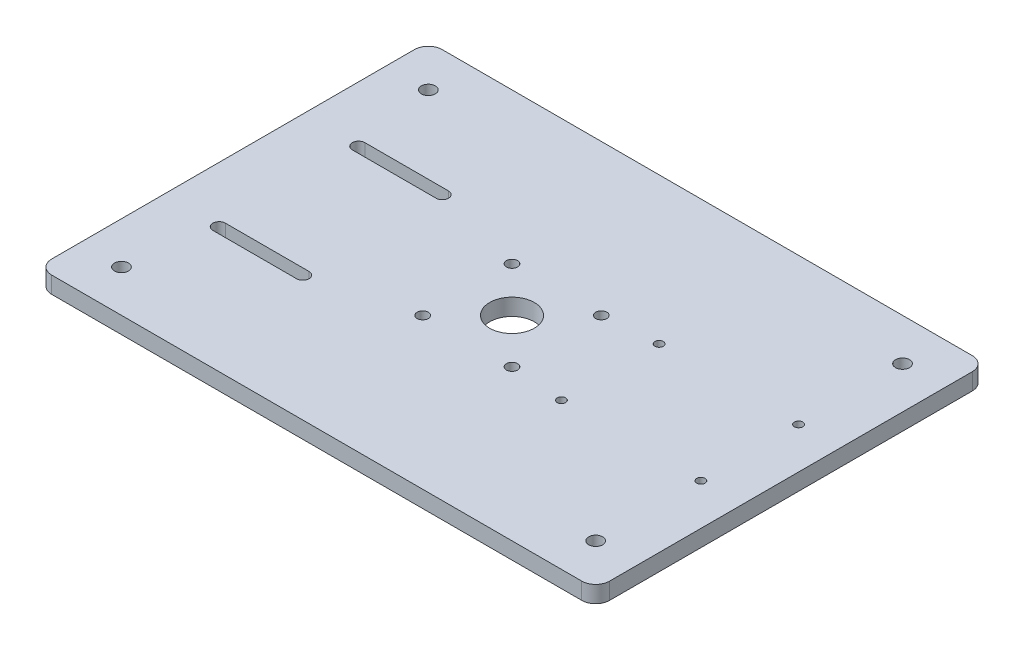
ISO-10303-21;
HEADER;
FILE_DESCRIPTION(('STEP AP214'),'2;1');
FILE_NAME('part.step','',(''),(''),'','','');
FILE_SCHEMA(('AUTOMOTIVE_DESIGN { 1 0 10303 214 1 1 1 1 }'));
ENDSEC;
DATA;
#1=APPLICATION_CONTEXT('core data for automotive mechanical design processes');
#2=APPLICATION_PROTOCOL_DEFINITION('international standard','automotive_design',2000,#1);
#3=PRODUCT_CONTEXT('',#1,'mechanical');
#4=PRODUCT('Part','Part','',(#3));
#5=PRODUCT_RELATED_PRODUCT_CATEGORY('part','',(#4));
#6=PRODUCT_DEFINITION_FORMATION('','',#4);
#7=PRODUCT_DEFINITION_CONTEXT('part definition',#1,'design');
#8=PRODUCT_DEFINITION('design','',#6,#7);
#9=PRODUCT_DEFINITION_SHAPE('','',#8);
#10=(LENGTH_UNIT() NAMED_UNIT(*) SI_UNIT(.MILLI.,.METRE.));
#11=(NAMED_UNIT(*) PLANE_ANGLE_UNIT() SI_UNIT($,.RADIAN.));
#12=(NAMED_UNIT(*) SI_UNIT($,.STERADIAN.) SOLID_ANGLE_UNIT());
#13=UNCERTAINTY_MEASURE_WITH_UNIT(LENGTH_MEASURE(1.E-05),#10,'distance_accuracy_value','');
#14=(GEOMETRIC_REPRESENTATION_CONTEXT(3) GLOBAL_UNCERTAINTY_ASSIGNED_CONTEXT((#13)) GLOBAL_UNIT_ASSIGNED_CONTEXT((#10,
#11,#12)) REPRESENTATION_CONTEXT('',''));
#15=CARTESIAN_POINT('',(0.,0.,0.));
#16=DIRECTION('',(0.,0.,1.));
#17=DIRECTION('',(1.,0.,0.));
#18=AXIS2_PLACEMENT_3D('',#15,#16,#17);
#19=CARTESIAN_POINT('',(100.,6.,-70.));
#20=DIRECTION('',(-1.,0.,0.));
#21=DIRECTION('',(0.,0.,1.));
#22=AXIS2_PLACEMENT_3D('',#19,#20,#21);
#23=PLANE('',#22);
#24=DIRECTION('',(0.,0.,-1.));
#25=VECTOR('',#24,1.);
#26=CARTESIAN_POINT('',(100.,0.,-70.));
#27=LINE('',#26,#25);
#28=CARTESIAN_POINT('',(100.,0.,65.));
#29=VERTEX_POINT('',#28);
#30=CARTESIAN_POINT('',(100.,0.,-65.));
#31=VERTEX_POINT('',#30);
#32=EDGE_CURVE('E276',#29,#31,#27,.T.);
#33=ORIENTED_EDGE('',*,*,#32,.T.);
#34=DIRECTION('',(0.,-1.,0.));
#35=VECTOR('',#34,1.);
#36=CARTESIAN_POINT('',(100.,6.,-65.));
#37=LINE('',#36,#35);
#38=CARTESIAN_POINT('',(100.,6.,-65.));
#39=VERTEX_POINT('',#38);
#40=EDGE_CURVE('E11',#31,#39,#37,.F.);
#41=ORIENTED_EDGE('',*,*,#40,.T.);
#42=DIRECTION('',(0.,0.,-1.));
#43=VECTOR('',#42,1.);
#44=CARTESIAN_POINT('',(100.,6.,-70.));
#45=LINE('',#44,#43);
#46=CARTESIAN_POINT('',(100.,6.,65.));
#47=VERTEX_POINT('',#46);
#48=EDGE_CURVE('E279',#47,#39,#45,.T.);
#49=ORIENTED_EDGE('',*,*,#48,.F.);
#50=DIRECTION('',(0.,-1.,0.));
#51=VECTOR('',#50,1.);
#52=CARTESIAN_POINT('',(100.,6.,65.));
#53=LINE('',#52,#51);
#54=EDGE_CURVE('E47',#47,#29,#53,.T.);
#55=ORIENTED_EDGE('',*,*,#54,.T.);
#56=EDGE_LOOP('',(#33,#41,#49,#55));
#57=FACE_BOUND('',#56,.T.);
#58=ADVANCED_FACE('F39',(#57),#23,.F.);
#59=CARTESIAN_POINT('',(-100.,6.,-70.));
#60=DIRECTION('',(0.,0.,1.));
#61=DIRECTION('',(1.,0.,0.));
#62=AXIS2_PLACEMENT_3D('',#59,#60,#61);
#63=PLANE('',#62);
#64=DIRECTION('',(-1.,0.,0.));
#65=VECTOR('',#64,1.);
#66=CARTESIAN_POINT('',(-100.,0.,-70.));
#67=LINE('',#66,#65);
#68=CARTESIAN_POINT('',(95.,0.,-70.));
#69=VERTEX_POINT('',#68);
#70=CARTESIAN_POINT('',(-95.,0.,-70.));
#71=VERTEX_POINT('',#70);
#72=EDGE_CURVE('E295',#69,#71,#67,.T.);
#73=ORIENTED_EDGE('',*,*,#72,.T.);
#74=DIRECTION('',(0.,-1.,0.));
#75=VECTOR('',#74,1.);
#76=CARTESIAN_POINT('',(-95.,6.,-70.));
#77=LINE('',#76,#75);
#78=CARTESIAN_POINT('',(-95.,6.,-70.));
#79=VERTEX_POINT('',#78);
#80=EDGE_CURVE('E318',#71,#79,#77,.F.);
#81=ORIENTED_EDGE('',*,*,#80,.T.);
#82=DIRECTION('',(-1.,0.,0.));
#83=VECTOR('',#82,1.);
#84=CARTESIAN_POINT('',(-100.,6.,-70.));
#85=LINE('',#84,#83);
#86=CARTESIAN_POINT('',(95.,6.,-70.));
#87=VERTEX_POINT('',#86);
#88=EDGE_CURVE('E282',#87,#79,#85,.T.);
#89=ORIENTED_EDGE('',*,*,#88,.F.);
#90=DIRECTION('',(0.,-1.,0.));
#91=VECTOR('',#90,1.);
#92=CARTESIAN_POINT('',(95.,6.,-70.));
#93=LINE('',#92,#91);
#94=EDGE_CURVE('E315',#87,#69,#93,.T.);
#95=ORIENTED_EDGE('',*,*,#94,.T.);
#96=EDGE_LOOP('',(#73,#81,#89,#95));
#97=FACE_BOUND('',#96,.T.);
#98=ADVANCED_FACE('F350',(#97),#63,.F.);
#99=CARTESIAN_POINT('',(-100.,6.,-70.));
#100=DIRECTION('',(1.,0.,0.));
#101=DIRECTION('',(0.,0.,-1.));
#102=AXIS2_PLACEMENT_3D('',#99,#100,#101);
#103=PLANE('',#102);
#104=DIRECTION('',(0.,0.,1.));
#105=VECTOR('',#104,1.);
#106=CARTESIAN_POINT('',(-100.,6.,-70.));
#107=LINE('',#106,#105);
#108=CARTESIAN_POINT('',(-100.,6.,-65.));
#109=VERTEX_POINT('',#108);
#110=CARTESIAN_POINT('',(-100.,6.,65.));
#111=VERTEX_POINT('',#110);
#112=EDGE_CURVE('E286',#109,#111,#107,.T.);
#113=ORIENTED_EDGE('',*,*,#112,.F.);
#114=DIRECTION('',(0.,-1.,0.));
#115=VECTOR('',#114,1.);
#116=CARTESIAN_POINT('',(-100.,6.,-65.));
#117=LINE('',#116,#115);
#118=CARTESIAN_POINT('',(-100.,0.,-65.));
#119=VERTEX_POINT('',#118);
#120=EDGE_CURVE('E304',#109,#119,#117,.T.);
#121=ORIENTED_EDGE('',*,*,#120,.T.);
#122=DIRECTION('',(0.,0.,1.));
#123=VECTOR('',#122,1.);
#124=CARTESIAN_POINT('',(-100.,0.,-70.));
#125=LINE('',#124,#123);
#126=CARTESIAN_POINT('',(-100.,0.,65.));
#127=VERTEX_POINT('',#126);
#128=EDGE_CURVE('E298',#119,#127,#125,.T.);
#129=ORIENTED_EDGE('',*,*,#128,.T.);
#130=DIRECTION('',(0.,-1.,0.));
#131=VECTOR('',#130,1.);
#132=CARTESIAN_POINT('',(-100.,6.,65.));
#133=LINE('',#132,#131);
#134=EDGE_CURVE('E292',#127,#111,#133,.F.);
#135=ORIENTED_EDGE('',*,*,#134,.T.);
#136=EDGE_LOOP('',(#113,#121,#129,#135));
#137=FACE_BOUND('',#136,.T.);
#138=ADVANCED_FACE('F360',(#137),#103,.F.);
#139=CARTESIAN_POINT('',(-100.,6.,70.));
#140=DIRECTION('',(0.,0.,-1.));
#141=DIRECTION('',(-1.,0.,0.));
#142=AXIS2_PLACEMENT_3D('',#139,#140,#141);
#143=PLANE('',#142);
#144=DIRECTION('',(1.,0.,0.));
#145=VECTOR('',#144,1.);
#146=CARTESIAN_POINT('',(-100.,6.,70.));
#147=LINE('',#146,#145);
#148=CARTESIAN_POINT('',(-95.,6.,70.));
#149=VERTEX_POINT('',#148);
#150=CARTESIAN_POINT('',(95.,6.,70.));
#151=VERTEX_POINT('',#150);
#152=EDGE_CURVE('E289',#149,#151,#147,.T.);
#153=ORIENTED_EDGE('',*,*,#152,.F.);
#154=DIRECTION('',(0.,-1.,0.));
#155=VECTOR('',#154,1.);
#156=CARTESIAN_POINT('',(-95.,6.,70.));
#157=LINE('',#156,#155);
#158=CARTESIAN_POINT('',(-95.,0.,70.));
#159=VERTEX_POINT('',#158);
#160=EDGE_CURVE('E330',#149,#159,#157,.T.);
#161=ORIENTED_EDGE('',*,*,#160,.T.);
#162=DIRECTION('',(1.,0.,0.));
#163=VECTOR('',#162,1.);
#164=CARTESIAN_POINT('',(-100.,0.,70.));
#165=LINE('',#164,#163);
#166=CARTESIAN_POINT('',(95.,0.,70.));
#167=VERTEX_POINT('',#166);
#168=EDGE_CURVE('E283',#159,#167,#165,.T.);
#169=ORIENTED_EDGE('',*,*,#168,.T.);
#170=DIRECTION('',(0.,-1.,0.));
#171=VECTOR('',#170,1.);
#172=CARTESIAN_POINT('',(95.,6.,70.));
#173=LINE('',#172,#171);
#174=EDGE_CURVE('E328',#167,#151,#173,.F.);
#175=ORIENTED_EDGE('',*,*,#174,.T.);
#176=EDGE_LOOP('',(#153,#161,#169,#175));
#177=FACE_BOUND('',#176,.T.);
#178=ADVANCED_FACE('F368',(#177),#143,.F.);
#179=CARTESIAN_POINT('',(0.,6.,0.));
#180=DIRECTION('',(0.,1.,0.));
#181=DIRECTION('',(0.,0.,1.));
#182=AXIS2_PLACEMENT_3D('',#179,#180,#181);
#183=PLANE('',#182);
#184=CARTESIAN_POINT('',(85.2222673702819,6.,17.4999999999999));
#185=DIRECTION('',(0.,1.,0.));
#186=DIRECTION('',(0.,0.,1.));
#187=AXIS2_PLACEMENT_3D('',#184,#185,#186);
#188=CIRCLE('',#187,1.5);
#189=CARTESIAN_POINT('',(85.2222673702819,6.,18.9999999999999));
#190=VERTEX_POINT('',#189);
#191=EDGE_CURVE('E674',#190,#190,#188,.T.);
#192=ORIENTED_EDGE('',*,*,#191,.F.);
#193=EDGE_LOOP('',(#192));
#194=FACE_BOUND('',#193,.T.);
#195=CARTESIAN_POINT('',(85.2222673702818,6.,-17.5000000000001));
#196=DIRECTION('',(0.,1.,0.));
#197=DIRECTION('',(0.,0.,1.));
#198=AXIS2_PLACEMENT_3D('',#195,#196,#197);
#199=CIRCLE('',#198,1.5);
#200=CARTESIAN_POINT('',(85.2222673702818,6.,-16.0000000000001));
#201=VERTEX_POINT('',#200);
#202=EDGE_CURVE('E678',#201,#201,#199,.T.);
#203=ORIENTED_EDGE('',*,*,#202,.F.);
#204=EDGE_LOOP('',(#203));
#205=FACE_BOUND('',#204,.T.);
#206=CARTESIAN_POINT('',(35.2222673702818,6.,-17.4999999999999));
#207=DIRECTION('',(0.,1.,0.));
#208=DIRECTION('',(0.,0.,1.));
#209=AXIS2_PLACEMENT_3D('',#206,#207,#208);
#210=CIRCLE('',#209,1.5);
#211=CARTESIAN_POINT('',(35.2222673702818,6.,-15.9999999999999));
#212=VERTEX_POINT('',#211);
#213=EDGE_CURVE('E671',#212,#212,#210,.T.);
#214=ORIENTED_EDGE('',*,*,#213,.F.);
#215=EDGE_LOOP('',(#214));
#216=FACE_BOUND('',#215,.T.);
#217=CARTESIAN_POINT('',(35.2222673702819,6.,17.5000000000001));
#218=DIRECTION('',(0.,1.,0.));
#219=DIRECTION('',(0.,0.,1.));
#220=AXIS2_PLACEMENT_3D('',#217,#218,#219);
#221=CIRCLE('',#220,1.50000000000001);
#222=CARTESIAN_POINT('',(35.2222673702819,6.,19.0000000000001));
#223=VERTEX_POINT('',#222);
#224=EDGE_CURVE('E178',#223,#223,#221,.T.);
#225=ORIENTED_EDGE('',*,*,#224,.F.);
#226=EDGE_LOOP('',(#225));
#227=FACE_BOUND('',#226,.T.);
#228=CARTESIAN_POINT('',(-80.,6.,-25.));
#229=DIRECTION('',(0.,1.,0.));
#230=DIRECTION('',(0.,0.,1.));
#231=AXIS2_PLACEMENT_3D('',#228,#229,#230);
#232=CIRCLE('',#231,2.25);
#233=CARTESIAN_POINT('',(-80.,6.,-27.25));
#234=VERTEX_POINT('',#233);
#235=CARTESIAN_POINT('',(-80.,6.,-22.75));
#236=VERTEX_POINT('',#235);
#237=EDGE_CURVE('E54',#234,#236,#232,.T.);
#238=ORIENTED_EDGE('',*,*,#237,.F.);
#239=DIRECTION('',(-1.,0.,0.));
#240=VECTOR('',#239,1.);
#241=CARTESIAN_POINT('',(-80.,6.,-27.25));
#242=LINE('',#241,#240);
#243=CARTESIAN_POINT('',(-50.,6.,-27.25));
#244=VERTEX_POINT('',#243);
#245=EDGE_CURVE('E172',#244,#234,#242,.T.);
#246=ORIENTED_EDGE('',*,*,#245,.F.);
#247=CARTESIAN_POINT('',(-50.,6.,-25.));
#248=DIRECTION('',(0.,1.,0.));
#249=DIRECTION('',(0.,0.,1.));
#250=AXIS2_PLACEMENT_3D('',#247,#248,#249);
#251=CIRCLE('',#250,2.24999999999999);
#252=CARTESIAN_POINT('',(-50.,6.,-22.75));
#253=VERTEX_POINT('',#252);
#254=EDGE_CURVE('E175',#253,#244,#251,.T.);
#255=ORIENTED_EDGE('',*,*,#254,.F.);
#256=DIRECTION('',(1.,0.,0.));
#257=VECTOR('',#256,1.);
#258=CARTESIAN_POINT('',(-80.,6.,-22.75));
#259=LINE('',#258,#257);
#260=EDGE_CURVE('E184',#236,#253,#259,.T.);
#261=ORIENTED_EDGE('',*,*,#260,.F.);
#262=EDGE_LOOP('',(#238,#246,#255,#261));
#263=FACE_BOUND('',#262,.T.);
#264=CARTESIAN_POINT('',(-80.,6.,25.));
#265=DIRECTION('',(0.,1.,0.));
#266=DIRECTION('',(0.,0.,1.));
#267=AXIS2_PLACEMENT_3D('',#264,#265,#266);
#268=CIRCLE('',#267,2.25);
#269=CARTESIAN_POINT('',(-80.,6.,22.75));
#270=VERTEX_POINT('',#269);
#271=CARTESIAN_POINT('',(-80.,6.,27.25));
#272=VERTEX_POINT('',#271);
#273=EDGE_CURVE('E62',#270,#272,#268,.T.);
#274=ORIENTED_EDGE('',*,*,#273,.F.);
#275=DIRECTION('',(-1.,0.,0.));
#276=VECTOR('',#275,1.);
#277=CARTESIAN_POINT('',(-80.,6.,22.75));
#278=LINE('',#277,#276);
#279=CARTESIAN_POINT('',(-50.,6.,22.75));
#280=VERTEX_POINT('',#279);
#281=EDGE_CURVE('E204',#280,#270,#278,.T.);
#282=ORIENTED_EDGE('',*,*,#281,.F.);
#283=CARTESIAN_POINT('',(-50.,6.,25.));
#284=DIRECTION('',(0.,1.,0.));
#285=DIRECTION('',(0.,0.,1.));
#286=AXIS2_PLACEMENT_3D('',#283,#284,#285);
#287=CIRCLE('',#286,2.25);
#288=CARTESIAN_POINT('',(-50.,6.,27.25));
#289=VERTEX_POINT('',#288);
#290=EDGE_CURVE('E207',#289,#280,#287,.T.);
#291=ORIENTED_EDGE('',*,*,#290,.F.);
#292=DIRECTION('',(1.,0.,0.));
#293=VECTOR('',#292,1.);
#294=CARTESIAN_POINT('',(-80.,6.,27.25));
#295=LINE('',#294,#293);
#296=EDGE_CURVE('E211',#272,#289,#295,.T.);
#297=ORIENTED_EDGE('',*,*,#296,.F.);
#298=EDGE_LOOP('',(#274,#282,#291,#297));
#299=FACE_BOUND('',#298,.T.);
#300=CARTESIAN_POINT('',(-16.,6.,-16.));
#301=DIRECTION('',(0.,1.,0.));
#302=DIRECTION('',(0.,0.,1.));
#303=AXIS2_PLACEMENT_3D('',#300,#301,#302);
#304=CIRCLE('',#303,2.);
#305=CARTESIAN_POINT('',(-16.,6.,-14.));
#306=VERTEX_POINT('',#305);
#307=EDGE_CURVE('E238',#306,#306,#304,.T.);
#308=ORIENTED_EDGE('',*,*,#307,.F.);
#309=EDGE_LOOP('',(#308));
#310=FACE_BOUND('',#309,.T.);
#311=CARTESIAN_POINT('',(-16.,6.,16.));
#312=DIRECTION('',(0.,1.,0.));
#313=DIRECTION('',(0.,0.,1.));
#314=AXIS2_PLACEMENT_3D('',#311,#312,#313);
#315=CIRCLE('',#314,2.);
#316=CARTESIAN_POINT('',(-16.,6.,18.));
#317=VERTEX_POINT('',#316);
#318=EDGE_CURVE('E232',#317,#317,#315,.T.);
#319=ORIENTED_EDGE('',*,*,#318,.F.);
#320=EDGE_LOOP('',(#319));
#321=FACE_BOUND('',#320,.T.);
#322=CARTESIAN_POINT('',(16.,6.,16.));
#323=DIRECTION('',(0.,1.,0.));
#324=DIRECTION('',(0.,0.,1.));
#325=AXIS2_PLACEMENT_3D('',#322,#323,#324);
#326=CIRCLE('',#325,2.);
#327=CARTESIAN_POINT('',(16.,6.,18.));
#328=VERTEX_POINT('',#327);
#329=EDGE_CURVE('E225',#328,#328,#326,.T.);
#330=ORIENTED_EDGE('',*,*,#329,.F.);
#331=EDGE_LOOP('',(#330));
#332=FACE_BOUND('',#331,.T.);
#333=CARTESIAN_POINT('',(16.,6.,-16.));
#334=DIRECTION('',(0.,1.,0.));
#335=DIRECTION('',(0.,0.,1.));
#336=AXIS2_PLACEMENT_3D('',#333,#334,#335);
#337=CIRCLE('',#336,2.);
#338=CARTESIAN_POINT('',(16.,6.,-14.));
#339=VERTEX_POINT('',#338);
#340=EDGE_CURVE('E228',#339,#339,#337,.T.);
#341=ORIENTED_EDGE('',*,*,#340,.F.);
#342=EDGE_LOOP('',(#341));
#343=FACE_BOUND('',#342,.T.);
#344=CARTESIAN_POINT('',(0.,6.,0.));
#345=DIRECTION('',(0.,1.,0.));
#346=DIRECTION('',(0.,0.,1.));
#347=AXIS2_PLACEMENT_3D('',#344,#345,#346);
#348=CIRCLE('',#347,8.);
#349=CARTESIAN_POINT('',(0.,6.,8.));
#350=VERTEX_POINT('',#349);
#351=EDGE_CURVE('E246',#350,#350,#348,.T.);
#352=ORIENTED_EDGE('',*,*,#351,.F.);
#353=EDGE_LOOP('',(#352));
#354=FACE_BOUND('',#353,.T.);
#355=CARTESIAN_POINT('',(85.,6.,-55.));
#356=DIRECTION('',(0.,1.,0.));
#357=DIRECTION('',(0.,0.,-1.));
#358=AXIS2_PLACEMENT_3D('',#355,#356,#357);
#359=CIRCLE('',#358,2.5);
#360=CARTESIAN_POINT('',(85.,6.,-57.5));
#361=VERTEX_POINT('',#360);
#362=EDGE_CURVE('E268',#361,#361,#359,.T.);
#363=ORIENTED_EDGE('',*,*,#362,.F.);
#364=EDGE_LOOP('',(#363));
#365=FACE_BOUND('',#364,.T.);
#366=CARTESIAN_POINT('',(85.,6.,55.));
#367=DIRECTION('',(0.,1.,0.));
#368=DIRECTION('',(0.,0.,1.));
#369=AXIS2_PLACEMENT_3D('',#366,#367,#368);
#370=CIRCLE('',#369,2.5);
#371=CARTESIAN_POINT('',(85.,6.,57.5));
#372=VERTEX_POINT('',#371);
#373=EDGE_CURVE('E262',#372,#372,#370,.T.);
#374=ORIENTED_EDGE('',*,*,#373,.F.);
#375=EDGE_LOOP('',(#374));
#376=FACE_BOUND('',#375,.T.);
#377=CARTESIAN_POINT('',(-85.,6.,55.));
#378=DIRECTION('',(0.,1.,0.));
#379=DIRECTION('',(0.,0.,-1.));
#380=AXIS2_PLACEMENT_3D('',#377,#378,#379);
#381=CIRCLE('',#380,2.5);
#382=CARTESIAN_POINT('',(-85.,6.,52.5));
#383=VERTEX_POINT('',#382);
#384=EDGE_CURVE('E255',#383,#383,#381,.T.);
#385=ORIENTED_EDGE('',*,*,#384,.F.);
#386=EDGE_LOOP('',(#385));
#387=FACE_BOUND('',#386,.T.);
#388=CARTESIAN_POINT('',(-85.,6.,-55.));
#389=DIRECTION('',(0.,1.,0.));
#390=DIRECTION('',(0.,0.,1.));
#391=AXIS2_PLACEMENT_3D('',#388,#389,#390);
#392=CIRCLE('',#391,2.5);
#393=CARTESIAN_POINT('',(-85.,6.,-52.5));
#394=VERTEX_POINT('',#393);
#395=EDGE_CURVE('E258',#394,#394,#392,.T.);
#396=ORIENTED_EDGE('',*,*,#395,.F.);
#397=EDGE_LOOP('',(#396));
#398=FACE_BOUND('',#397,.T.);
#399=ORIENTED_EDGE('',*,*,#88,.T.);
#400=CARTESIAN_POINT('',(-95.,6.,-65.));
#401=DIRECTION('',(0.,1.,0.));
#402=DIRECTION('',(0.,0.,1.));
#403=AXIS2_PLACEMENT_3D('',#400,#401,#402);
#404=CIRCLE('',#403,5.);
#405=EDGE_CURVE('E326',#79,#109,#404,.T.);
#406=ORIENTED_EDGE('',*,*,#405,.T.);
#407=ORIENTED_EDGE('',*,*,#112,.T.);
#408=CARTESIAN_POINT('',(-95.,6.,65.));
#409=DIRECTION('',(0.,1.,0.));
#410=DIRECTION('',(0.,0.,1.));
#411=AXIS2_PLACEMENT_3D('',#408,#409,#410);
#412=CIRCLE('',#411,5.);
#413=EDGE_CURVE('E324',#111,#149,#412,.T.);
#414=ORIENTED_EDGE('',*,*,#413,.T.);
#415=ORIENTED_EDGE('',*,*,#152,.T.);
#416=CARTESIAN_POINT('',(95.,6.,65.));
#417=DIRECTION('',(0.,1.,0.));
#418=DIRECTION('',(0.,0.,1.));
#419=AXIS2_PLACEMENT_3D('',#416,#417,#418);
#420=CIRCLE('',#419,5.);
#421=EDGE_CURVE('E320',#151,#47,#420,.T.);
#422=ORIENTED_EDGE('',*,*,#421,.T.);
#423=ORIENTED_EDGE('',*,*,#48,.T.);
#424=CARTESIAN_POINT('',(95.,6.,-65.));
#425=DIRECTION('',(0.,1.,0.));
#426=DIRECTION('',(0.,0.,1.));
#427=AXIS2_PLACEMENT_3D('',#424,#425,#426);
#428=CIRCLE('',#427,5.);
#429=EDGE_CURVE('E322',#39,#87,#428,.T.);
#430=ORIENTED_EDGE('',*,*,#429,.T.);
#431=EDGE_LOOP('',(#399,#406,#407,#414,#415,#422,#423,#430));
#432=FACE_BOUND('',#431,.T.);
#433=ADVANCED_FACE('F354',(#194,#205,#216,#227,#263,#299,#310,#321,#332,#343,#354,#365,#376,
#387,#398,#432),#183,.T.);
#434=CARTESIAN_POINT('',(0.,0.,0.));
#435=DIRECTION('',(0.,1.,0.));
#436=DIRECTION('',(0.,0.,1.));
#437=AXIS2_PLACEMENT_3D('',#434,#435,#436);
#438=PLANE('',#437);
#439=CARTESIAN_POINT('',(85.2222673702819,0.,17.4999999999999));
#440=DIRECTION('',(0.,1.,0.));
#441=DIRECTION('',(0.,0.,1.));
#442=AXIS2_PLACEMENT_3D('',#439,#440,#441);
#443=CIRCLE('',#442,1.5);
#444=CARTESIAN_POINT('',(85.2222673702819,0.,18.9999999999999));
#445=VERTEX_POINT('',#444);
#446=EDGE_CURVE('E659',#445,#445,#443,.T.);
#447=ORIENTED_EDGE('',*,*,#446,.T.);
#448=EDGE_LOOP('',(#447));
#449=FACE_BOUND('',#448,.T.);
#450=CARTESIAN_POINT('',(85.2222673702818,0.,-17.5000000000001));
#451=DIRECTION('',(0.,1.,0.));
#452=DIRECTION('',(0.,0.,1.));
#453=AXIS2_PLACEMENT_3D('',#450,#451,#452);
#454=CIRCLE('',#453,1.5);
#455=CARTESIAN_POINT('',(85.2222673702818,0.,-16.0000000000001));
#456=VERTEX_POINT('',#455);
#457=EDGE_CURVE('E663',#456,#456,#454,.T.);
#458=ORIENTED_EDGE('',*,*,#457,.T.);
#459=EDGE_LOOP('',(#458));
#460=FACE_BOUND('',#459,.T.);
#461=CARTESIAN_POINT('',(35.2222673702818,0.,-17.4999999999999));
#462=DIRECTION('',(0.,1.,0.));
#463=DIRECTION('',(0.,0.,1.));
#464=AXIS2_PLACEMENT_3D('',#461,#462,#463);
#465=CIRCLE('',#464,1.5);
#466=CARTESIAN_POINT('',(35.2222673702818,0.,-15.9999999999999));
#467=VERTEX_POINT('',#466);
#468=EDGE_CURVE('E667',#467,#467,#465,.T.);
#469=ORIENTED_EDGE('',*,*,#468,.T.);
#470=EDGE_LOOP('',(#469));
#471=FACE_BOUND('',#470,.T.);
#472=CARTESIAN_POINT('',(35.2222673702819,0.,17.5000000000001));
#473=DIRECTION('',(0.,1.,0.));
#474=DIRECTION('',(0.,0.,1.));
#475=AXIS2_PLACEMENT_3D('',#472,#473,#474);
#476=CIRCLE('',#475,1.50000000000001);
#477=CARTESIAN_POINT('',(35.2222673702819,0.,19.0000000000001));
#478=VERTEX_POINT('',#477);
#479=EDGE_CURVE('E203',#478,#478,#476,.T.);
#480=ORIENTED_EDGE('',*,*,#479,.T.);
#481=EDGE_LOOP('',(#480));
#482=FACE_BOUND('',#481,.T.);
#483=DIRECTION('',(-1.,0.,0.));
#484=VECTOR('',#483,1.);
#485=CARTESIAN_POINT('',(-80.,0.,-27.25));
#486=LINE('',#485,#484);
#487=CARTESIAN_POINT('',(-50.,0.,-27.25));
#488=VERTEX_POINT('',#487);
#489=CARTESIAN_POINT('',(-80.,0.,-27.25));
#490=VERTEX_POINT('',#489);
#491=EDGE_CURVE('E159',#488,#490,#486,.T.);
#492=ORIENTED_EDGE('',*,*,#491,.T.);
#493=CARTESIAN_POINT('',(-80.,0.,-25.));
#494=DIRECTION('',(0.,1.,0.));
#495=DIRECTION('',(0.,0.,1.));
#496=AXIS2_PLACEMENT_3D('',#493,#494,#495);
#497=CIRCLE('',#496,2.25);
#498=CARTESIAN_POINT('',(-80.,0.,-22.75));
#499=VERTEX_POINT('',#498);
#500=EDGE_CURVE('E153',#490,#499,#497,.T.);
#501=ORIENTED_EDGE('',*,*,#500,.T.);
#502=DIRECTION('',(1.,0.,0.));
#503=VECTOR('',#502,1.);
#504=CARTESIAN_POINT('',(-80.,0.,-22.75));
#505=LINE('',#504,#503);
#506=CARTESIAN_POINT('',(-50.,0.,-22.75));
#507=VERTEX_POINT('',#506);
#508=EDGE_CURVE('E163',#499,#507,#505,.T.);
#509=ORIENTED_EDGE('',*,*,#508,.T.);
#510=CARTESIAN_POINT('',(-50.,0.,-25.));
#511=DIRECTION('',(0.,1.,0.));
#512=DIRECTION('',(0.,0.,1.));
#513=AXIS2_PLACEMENT_3D('',#510,#511,#512);
#514=CIRCLE('',#513,2.24999999999999);
#515=EDGE_CURVE('E167',#507,#488,#514,.T.);
#516=ORIENTED_EDGE('',*,*,#515,.T.);
#517=EDGE_LOOP('',(#492,#501,#509,#516));
#518=FACE_BOUND('',#517,.T.);
#519=DIRECTION('',(-1.,0.,0.));
#520=VECTOR('',#519,1.);
#521=CARTESIAN_POINT('',(-80.,0.,22.75));
#522=LINE('',#521,#520);
#523=CARTESIAN_POINT('',(-50.,0.,22.75));
#524=VERTEX_POINT('',#523);
#525=CARTESIAN_POINT('',(-80.,0.,22.75));
#526=VERTEX_POINT('',#525);
#527=EDGE_CURVE('E196',#524,#526,#522,.T.);
#528=ORIENTED_EDGE('',*,*,#527,.T.);
#529=CARTESIAN_POINT('',(-80.,0.,25.));
#530=DIRECTION('',(0.,1.,0.));
#531=DIRECTION('',(0.,0.,1.));
#532=AXIS2_PLACEMENT_3D('',#529,#530,#531);
#533=CIRCLE('',#532,2.25);
#534=CARTESIAN_POINT('',(-80.,0.,27.25));
#535=VERTEX_POINT('',#534);
#536=EDGE_CURVE('E208',#526,#535,#533,.T.);
#537=ORIENTED_EDGE('',*,*,#536,.T.);
#538=DIRECTION('',(1.,0.,0.));
#539=VECTOR('',#538,1.);
#540=CARTESIAN_POINT('',(-80.,0.,27.25));
#541=LINE('',#540,#539);
#542=CARTESIAN_POINT('',(-50.,0.,27.25));
#543=VERTEX_POINT('',#542);
#544=EDGE_CURVE('E220',#535,#543,#541,.T.);
#545=ORIENTED_EDGE('',*,*,#544,.T.);
#546=CARTESIAN_POINT('',(-50.,0.,25.));
#547=DIRECTION('',(0.,1.,0.));
#548=DIRECTION('',(0.,0.,1.));
#549=AXIS2_PLACEMENT_3D('',#546,#547,#548);
#550=CIRCLE('',#549,2.25);
#551=EDGE_CURVE('E217',#543,#524,#550,.T.);
#552=ORIENTED_EDGE('',*,*,#551,.T.);
#553=EDGE_LOOP('',(#528,#537,#545,#552));
#554=FACE_BOUND('',#553,.T.);
#555=CARTESIAN_POINT('',(-16.,0.,-16.));
#556=DIRECTION('',(0.,1.,0.));
#557=DIRECTION('',(0.,0.,1.));
#558=AXIS2_PLACEMENT_3D('',#555,#556,#557);
#559=CIRCLE('',#558,2.);
#560=CARTESIAN_POINT('',(-16.,0.,-14.));
#561=VERTEX_POINT('',#560);
#562=EDGE_CURVE('E190',#561,#561,#559,.T.);
#563=ORIENTED_EDGE('',*,*,#562,.T.);
#564=EDGE_LOOP('',(#563));
#565=FACE_BOUND('',#564,.T.);
#566=CARTESIAN_POINT('',(-16.,0.,16.));
#567=DIRECTION('',(0.,1.,0.));
#568=DIRECTION('',(0.,0.,1.));
#569=AXIS2_PLACEMENT_3D('',#566,#567,#568);
#570=CIRCLE('',#569,2.);
#571=CARTESIAN_POINT('',(-16.,0.,18.));
#572=VERTEX_POINT('',#571);
#573=EDGE_CURVE('E235',#572,#572,#570,.T.);
#574=ORIENTED_EDGE('',*,*,#573,.T.);
#575=EDGE_LOOP('',(#574));
#576=FACE_BOUND('',#575,.T.);
#577=CARTESIAN_POINT('',(16.,0.,16.));
#578=DIRECTION('',(0.,1.,0.));
#579=DIRECTION('',(0.,0.,1.));
#580=AXIS2_PLACEMENT_3D('',#577,#578,#579);
#581=CIRCLE('',#580,2.);
#582=CARTESIAN_POINT('',(16.,0.,18.));
#583=VERTEX_POINT('',#582);
#584=EDGE_CURVE('E229',#583,#583,#581,.T.);
#585=ORIENTED_EDGE('',*,*,#584,.T.);
#586=EDGE_LOOP('',(#585));
#587=FACE_BOUND('',#586,.T.);
#588=CARTESIAN_POINT('',(16.,0.,-16.));
#589=DIRECTION('',(0.,1.,0.));
#590=DIRECTION('',(0.,0.,1.));
#591=AXIS2_PLACEMENT_3D('',#588,#589,#590);
#592=CIRCLE('',#591,2.);
#593=CARTESIAN_POINT('',(16.,0.,-14.));
#594=VERTEX_POINT('',#593);
#595=EDGE_CURVE('E243',#594,#594,#592,.T.);
#596=ORIENTED_EDGE('',*,*,#595,.T.);
#597=EDGE_LOOP('',(#596));
#598=FACE_BOUND('',#597,.T.);
#599=CARTESIAN_POINT('',(0.,0.,0.));
#600=DIRECTION('',(0.,1.,0.));
#601=DIRECTION('',(0.,0.,1.));
#602=AXIS2_PLACEMENT_3D('',#599,#600,#601);
#603=CIRCLE('',#602,8.);
#604=CARTESIAN_POINT('',(0.,0.,8.));
#605=VERTEX_POINT('',#604);
#606=EDGE_CURVE('E249',#605,#605,#603,.T.);
#607=ORIENTED_EDGE('',*,*,#606,.T.);
#608=EDGE_LOOP('',(#607));
#609=FACE_BOUND('',#608,.T.);
#610=CARTESIAN_POINT('',(85.,0.,-55.));
#611=DIRECTION('',(0.,1.,0.));
#612=DIRECTION('',(0.,0.,-1.));
#613=AXIS2_PLACEMENT_3D('',#610,#611,#612);
#614=CIRCLE('',#613,2.5);
#615=CARTESIAN_POINT('',(85.,0.,-57.5));
#616=VERTEX_POINT('',#615);
#617=EDGE_CURVE('E252',#616,#616,#614,.T.);
#618=ORIENTED_EDGE('',*,*,#617,.T.);
#619=EDGE_LOOP('',(#618));
#620=FACE_BOUND('',#619,.T.);
#621=CARTESIAN_POINT('',(85.,0.,55.));
#622=DIRECTION('',(0.,1.,0.));
#623=DIRECTION('',(0.,0.,1.));
#624=AXIS2_PLACEMENT_3D('',#621,#622,#623);
#625=CIRCLE('',#624,2.5);
#626=CARTESIAN_POINT('',(85.,0.,57.5));
#627=VERTEX_POINT('',#626);
#628=EDGE_CURVE('E265',#627,#627,#625,.T.);
#629=ORIENTED_EDGE('',*,*,#628,.T.);
#630=EDGE_LOOP('',(#629));
#631=FACE_BOUND('',#630,.T.);
#632=CARTESIAN_POINT('',(-85.,0.,55.));
#633=DIRECTION('',(0.,1.,0.));
#634=DIRECTION('',(0.,0.,-1.));
#635=AXIS2_PLACEMENT_3D('',#632,#633,#634);
#636=CIRCLE('',#635,2.5);
#637=CARTESIAN_POINT('',(-85.,0.,52.5));
#638=VERTEX_POINT('',#637);
#639=EDGE_CURVE('E259',#638,#638,#636,.T.);
#640=ORIENTED_EDGE('',*,*,#639,.T.);
#641=EDGE_LOOP('',(#640));
#642=FACE_BOUND('',#641,.T.);
#643=CARTESIAN_POINT('',(-85.,0.,-55.));
#644=DIRECTION('',(0.,1.,0.));
#645=DIRECTION('',(0.,0.,1.));
#646=AXIS2_PLACEMENT_3D('',#643,#644,#645);
#647=CIRCLE('',#646,2.5);
#648=CARTESIAN_POINT('',(-85.,0.,-52.5));
#649=VERTEX_POINT('',#648);
#650=EDGE_CURVE('E273',#649,#649,#647,.T.);
#651=ORIENTED_EDGE('',*,*,#650,.T.);
#652=EDGE_LOOP('',(#651));
#653=FACE_BOUND('',#652,.T.);
#654=ORIENTED_EDGE('',*,*,#128,.F.);
#655=CARTESIAN_POINT('',(-95.,0.,-65.));
#656=DIRECTION('',(0.,1.,0.));
#657=DIRECTION('',(0.,0.,1.));
#658=AXIS2_PLACEMENT_3D('',#655,#656,#657);
#659=CIRCLE('',#658,5.);
#660=EDGE_CURVE('E313',#119,#71,#659,.F.);
#661=ORIENTED_EDGE('',*,*,#660,.T.);
#662=ORIENTED_EDGE('',*,*,#72,.F.);
#663=CARTESIAN_POINT('',(95.,0.,-65.));
#664=DIRECTION('',(0.,1.,0.));
#665=DIRECTION('',(0.,0.,1.));
#666=AXIS2_PLACEMENT_3D('',#663,#664,#665);
#667=CIRCLE('',#666,5.);
#668=EDGE_CURVE('E309',#69,#31,#667,.F.);
#669=ORIENTED_EDGE('',*,*,#668,.T.);
#670=ORIENTED_EDGE('',*,*,#32,.F.);
#671=CARTESIAN_POINT('',(95.,0.,65.));
#672=DIRECTION('',(0.,1.,0.));
#673=DIRECTION('',(0.,0.,1.));
#674=AXIS2_PLACEMENT_3D('',#671,#672,#673);
#675=CIRCLE('',#674,5.);
#676=EDGE_CURVE('E307',#29,#167,#675,.F.);
#677=ORIENTED_EDGE('',*,*,#676,.T.);
#678=ORIENTED_EDGE('',*,*,#168,.F.);
#679=CARTESIAN_POINT('',(-95.,0.,65.));
#680=DIRECTION('',(0.,1.,0.));
#681=DIRECTION('',(0.,0.,1.));
#682=AXIS2_PLACEMENT_3D('',#679,#680,#681);
#683=CIRCLE('',#682,5.);
#684=EDGE_CURVE('E311',#159,#127,#683,.F.);
#685=ORIENTED_EDGE('',*,*,#684,.T.);
#686=EDGE_LOOP('',(#654,#661,#662,#669,#670,#677,#678,#685));
#687=FACE_BOUND('',#686,.T.);
#688=ADVANCED_FACE('F169',(#449,#460,#471,#482,#518,#554,#565,#576,#587,#598,#609,#620,#631,
#642,#653,#687),#438,.F.);
#689=CARTESIAN_POINT('',(-95.,6.,-65.));
#690=DIRECTION('',(0.,-1.,0.));
#691=DIRECTION('',(0.,0.,-1.));
#692=AXIS2_PLACEMENT_3D('',#689,#690,#691);
#693=CYLINDRICAL_SURFACE('',#692,5.);
#694=ORIENTED_EDGE('',*,*,#405,.F.);
#695=ORIENTED_EDGE('',*,*,#80,.F.);
#696=ORIENTED_EDGE('',*,*,#660,.F.);
#697=ORIENTED_EDGE('',*,*,#120,.F.);
#698=EDGE_LOOP('',(#694,#695,#696,#697));
#699=FACE_BOUND('',#698,.T.);
#700=ADVANCED_FACE('F358',(#699),#693,.T.);
#701=CARTESIAN_POINT('',(-95.,6.,65.));
#702=DIRECTION('',(0.,-1.,0.));
#703=DIRECTION('',(0.,0.,-1.));
#704=AXIS2_PLACEMENT_3D('',#701,#702,#703);
#705=CYLINDRICAL_SURFACE('',#704,5.);
#706=ORIENTED_EDGE('',*,*,#413,.F.);
#707=ORIENTED_EDGE('',*,*,#134,.F.);
#708=ORIENTED_EDGE('',*,*,#684,.F.);
#709=ORIENTED_EDGE('',*,*,#160,.F.);
#710=EDGE_LOOP('',(#706,#707,#708,#709));
#711=FACE_BOUND('',#710,.T.);
#712=ADVANCED_FACE('F365',(#711),#705,.T.);
#713=CARTESIAN_POINT('',(95.,6.,-65.));
#714=DIRECTION('',(0.,-1.,0.));
#715=DIRECTION('',(0.,0.,-1.));
#716=AXIS2_PLACEMENT_3D('',#713,#714,#715);
#717=CYLINDRICAL_SURFACE('',#716,5.);
#718=ORIENTED_EDGE('',*,*,#429,.F.);
#719=ORIENTED_EDGE('',*,*,#40,.F.);
#720=ORIENTED_EDGE('',*,*,#668,.F.);
#721=ORIENTED_EDGE('',*,*,#94,.F.);
#722=EDGE_LOOP('',(#718,#719,#720,#721));
#723=FACE_BOUND('',#722,.T.);
#724=ADVANCED_FACE('F347',(#723),#717,.T.);
#725=CARTESIAN_POINT('',(95.,6.,65.));
#726=DIRECTION('',(0.,-1.,0.));
#727=DIRECTION('',(0.,0.,-1.));
#728=AXIS2_PLACEMENT_3D('',#725,#726,#727);
#729=CYLINDRICAL_SURFACE('',#728,5.);
#730=ORIENTED_EDGE('',*,*,#421,.F.);
#731=ORIENTED_EDGE('',*,*,#174,.F.);
#732=ORIENTED_EDGE('',*,*,#676,.F.);
#733=ORIENTED_EDGE('',*,*,#54,.F.);
#734=EDGE_LOOP('',(#730,#731,#732,#733));
#735=FACE_BOUND('',#734,.T.);
#736=ADVANCED_FACE('F41',(#735),#729,.T.);
#737=CARTESIAN_POINT('',(-85.,0.,-55.));
#738=DIRECTION('',(0.,1.,0.));
#739=DIRECTION('',(0.,0.,1.));
#740=AXIS2_PLACEMENT_3D('',#737,#738,#739);
#741=CYLINDRICAL_SURFACE('',#740,2.5);
#742=ORIENTED_EDGE('',*,*,#650,.F.);
#743=EDGE_LOOP('',(#742));
#744=FACE_BOUND('',#743,.T.);
#745=ORIENTED_EDGE('',*,*,#395,.T.);
#746=EDGE_LOOP('',(#745));
#747=FACE_BOUND('',#746,.T.);
#748=ADVANCED_FACE('F371',(#744,#747),#741,.F.);
#749=CARTESIAN_POINT('',(-85.,0.,55.));
#750=DIRECTION('',(0.,1.,0.));
#751=DIRECTION('',(0.,0.,1.));
#752=AXIS2_PLACEMENT_3D('',#749,#750,#751);
#753=CYLINDRICAL_SURFACE('',#752,2.5);
#754=ORIENTED_EDGE('',*,*,#639,.F.);
#755=EDGE_LOOP('',(#754));
#756=FACE_BOUND('',#755,.T.);
#757=ORIENTED_EDGE('',*,*,#384,.T.);
#758=EDGE_LOOP('',(#757));
#759=FACE_BOUND('',#758,.T.);
#760=ADVANCED_FACE('F376',(#756,#759),#753,.F.);
#761=CARTESIAN_POINT('',(85.,0.,55.));
#762=DIRECTION('',(0.,1.,0.));
#763=DIRECTION('',(0.,0.,1.));
#764=AXIS2_PLACEMENT_3D('',#761,#762,#763);
#765=CYLINDRICAL_SURFACE('',#764,2.5);
#766=ORIENTED_EDGE('',*,*,#628,.F.);
#767=EDGE_LOOP('',(#766));
#768=FACE_BOUND('',#767,.T.);
#769=ORIENTED_EDGE('',*,*,#373,.T.);
#770=EDGE_LOOP('',(#769));
#771=FACE_BOUND('',#770,.T.);
#772=ADVANCED_FACE('F420',(#768,#771),#765,.F.);
#773=CARTESIAN_POINT('',(85.,0.,-55.));
#774=DIRECTION('',(0.,1.,0.));
#775=DIRECTION('',(0.,0.,1.));
#776=AXIS2_PLACEMENT_3D('',#773,#774,#775);
#777=CYLINDRICAL_SURFACE('',#776,2.5);
#778=ORIENTED_EDGE('',*,*,#617,.F.);
#779=EDGE_LOOP('',(#778));
#780=FACE_BOUND('',#779,.T.);
#781=ORIENTED_EDGE('',*,*,#362,.T.);
#782=EDGE_LOOP('',(#781));
#783=FACE_BOUND('',#782,.T.);
#784=ADVANCED_FACE('F430',(#780,#783),#777,.F.);
#785=CARTESIAN_POINT('',(0.,0.,0.));
#786=DIRECTION('',(0.,1.,0.));
#787=DIRECTION('',(0.,0.,1.));
#788=AXIS2_PLACEMENT_3D('',#785,#786,#787);
#789=CYLINDRICAL_SURFACE('',#788,8.);
#790=ORIENTED_EDGE('',*,*,#606,.F.);
#791=EDGE_LOOP('',(#790));
#792=FACE_BOUND('',#791,.T.);
#793=ORIENTED_EDGE('',*,*,#351,.T.);
#794=EDGE_LOOP('',(#793));
#795=FACE_BOUND('',#794,.T.);
#796=ADVANCED_FACE('F440',(#792,#795),#789,.F.);
#797=CARTESIAN_POINT('',(16.,0.,-16.));
#798=DIRECTION('',(0.,1.,0.));
#799=DIRECTION('',(0.,0.,1.));
#800=AXIS2_PLACEMENT_3D('',#797,#798,#799);
#801=CYLINDRICAL_SURFACE('',#800,2.);
#802=ORIENTED_EDGE('',*,*,#595,.F.);
#803=EDGE_LOOP('',(#802));
#804=FACE_BOUND('',#803,.T.);
#805=ORIENTED_EDGE('',*,*,#340,.T.);
#806=EDGE_LOOP('',(#805));
#807=FACE_BOUND('',#806,.T.);
#808=ADVANCED_FACE('F450',(#804,#807),#801,.F.);
#809=CARTESIAN_POINT('',(16.,0.,16.));
#810=DIRECTION('',(0.,1.,0.));
#811=DIRECTION('',(0.,0.,1.));
#812=AXIS2_PLACEMENT_3D('',#809,#810,#811);
#813=CYLINDRICAL_SURFACE('',#812,2.);
#814=ORIENTED_EDGE('',*,*,#584,.F.);
#815=EDGE_LOOP('',(#814));
#816=FACE_BOUND('',#815,.T.);
#817=ORIENTED_EDGE('',*,*,#329,.T.);
#818=EDGE_LOOP('',(#817));
#819=FACE_BOUND('',#818,.T.);
#820=ADVANCED_FACE('F460',(#816,#819),#813,.F.);
#821=CARTESIAN_POINT('',(-16.,0.,16.));
#822=DIRECTION('',(0.,1.,0.));
#823=DIRECTION('',(0.,0.,1.));
#824=AXIS2_PLACEMENT_3D('',#821,#822,#823);
#825=CYLINDRICAL_SURFACE('',#824,2.);
#826=ORIENTED_EDGE('',*,*,#573,.F.);
#827=EDGE_LOOP('',(#826));
#828=FACE_BOUND('',#827,.T.);
#829=ORIENTED_EDGE('',*,*,#318,.T.);
#830=EDGE_LOOP('',(#829));
#831=FACE_BOUND('',#830,.T.);
#832=ADVANCED_FACE('F470',(#828,#831),#825,.F.);
#833=CARTESIAN_POINT('',(-16.,0.,-16.));
#834=DIRECTION('',(0.,1.,0.));
#835=DIRECTION('',(0.,0.,1.));
#836=AXIS2_PLACEMENT_3D('',#833,#834,#835);
#837=CYLINDRICAL_SURFACE('',#836,2.);
#838=ORIENTED_EDGE('',*,*,#562,.F.);
#839=EDGE_LOOP('',(#838));
#840=FACE_BOUND('',#839,.T.);
#841=ORIENTED_EDGE('',*,*,#307,.T.);
#842=EDGE_LOOP('',(#841));
#843=FACE_BOUND('',#842,.T.);
#844=ADVANCED_FACE('F480',(#840,#843),#837,.F.);
#845=CARTESIAN_POINT('',(-80.,0.,25.));
#846=DIRECTION('',(0.,1.,0.));
#847=DIRECTION('',(0.,0.,1.));
#848=AXIS2_PLACEMENT_3D('',#845,#846,#847);
#849=CYLINDRICAL_SURFACE('',#848,2.25);
#850=ORIENTED_EDGE('',*,*,#273,.T.);
#851=DIRECTION('',(0.,1.,0.));
#852=VECTOR('',#851,1.);
#853=CARTESIAN_POINT('',(-80.,0.,27.25));
#854=LINE('',#853,#852);
#855=EDGE_CURVE('E194',#535,#272,#854,.T.);
#856=ORIENTED_EDGE('',*,*,#855,.F.);
#857=ORIENTED_EDGE('',*,*,#536,.F.);
#858=DIRECTION('',(0.,1.,0.));
#859=VECTOR('',#858,1.);
#860=CARTESIAN_POINT('',(-80.,0.,22.75));
#861=LINE('',#860,#859);
#862=EDGE_CURVE('E201',#526,#270,#861,.T.);
#863=ORIENTED_EDGE('',*,*,#862,.T.);
#864=EDGE_LOOP('',(#850,#856,#857,#863));
#865=FACE_BOUND('',#864,.T.);
#866=ADVANCED_FACE('F490',(#865),#849,.F.);
#867=CARTESIAN_POINT('',(-80.,0.,22.75));
#868=DIRECTION('',(0.,0.,-1.));
#869=DIRECTION('',(-1.,0.,0.));
#870=AXIS2_PLACEMENT_3D('',#867,#868,#869);
#871=PLANE('',#870);
#872=ORIENTED_EDGE('',*,*,#281,.T.);
#873=ORIENTED_EDGE('',*,*,#862,.F.);
#874=ORIENTED_EDGE('',*,*,#527,.F.);
#875=DIRECTION('',(0.,1.,0.));
#876=VECTOR('',#875,1.);
#877=CARTESIAN_POINT('',(-50.,0.,22.75));
#878=LINE('',#877,#876);
#879=EDGE_CURVE('E199',#524,#280,#878,.T.);
#880=ORIENTED_EDGE('',*,*,#879,.T.);
#881=EDGE_LOOP('',(#872,#873,#874,#880));
#882=FACE_BOUND('',#881,.T.);
#883=ADVANCED_FACE('F500',(#882),#871,.F.);
#884=CARTESIAN_POINT('',(-50.,0.,25.));
#885=DIRECTION('',(0.,1.,0.));
#886=DIRECTION('',(0.,0.,1.));
#887=AXIS2_PLACEMENT_3D('',#884,#885,#886);
#888=CYLINDRICAL_SURFACE('',#887,2.25);
#889=ORIENTED_EDGE('',*,*,#290,.T.);
#890=ORIENTED_EDGE('',*,*,#879,.F.);
#891=ORIENTED_EDGE('',*,*,#551,.F.);
#892=DIRECTION('',(0.,1.,0.));
#893=VECTOR('',#892,1.);
#894=CARTESIAN_POINT('',(-50.,0.,27.25));
#895=LINE('',#894,#893);
#896=EDGE_CURVE('E197',#543,#289,#895,.T.);
#897=ORIENTED_EDGE('',*,*,#896,.T.);
#898=EDGE_LOOP('',(#889,#890,#891,#897));
#899=FACE_BOUND('',#898,.T.);
#900=ADVANCED_FACE('F509',(#899),#888,.F.);
#901=CARTESIAN_POINT('',(-80.,0.,27.25));
#902=DIRECTION('',(0.,0.,1.));
#903=DIRECTION('',(1.,0.,0.));
#904=AXIS2_PLACEMENT_3D('',#901,#902,#903);
#905=PLANE('',#904);
#906=ORIENTED_EDGE('',*,*,#296,.T.);
#907=ORIENTED_EDGE('',*,*,#896,.F.);
#908=ORIENTED_EDGE('',*,*,#544,.F.);
#909=ORIENTED_EDGE('',*,*,#855,.T.);
#910=EDGE_LOOP('',(#906,#907,#908,#909));
#911=FACE_BOUND('',#910,.T.);
#912=ADVANCED_FACE('F519',(#911),#905,.F.);
#913=CARTESIAN_POINT('',(-80.,0.,-25.));
#914=DIRECTION('',(0.,1.,0.));
#915=DIRECTION('',(0.,0.,1.));
#916=AXIS2_PLACEMENT_3D('',#913,#914,#915);
#917=CYLINDRICAL_SURFACE('',#916,2.25);
#918=ORIENTED_EDGE('',*,*,#237,.T.);
#919=DIRECTION('',(0.,1.,0.));
#920=VECTOR('',#919,1.);
#921=CARTESIAN_POINT('',(-80.,0.,-22.75));
#922=LINE('',#921,#920);
#923=EDGE_CURVE('E149',#499,#236,#922,.T.);
#924=ORIENTED_EDGE('',*,*,#923,.F.);
#925=ORIENTED_EDGE('',*,*,#500,.F.);
#926=DIRECTION('',(0.,1.,0.));
#927=VECTOR('',#926,1.);
#928=CARTESIAN_POINT('',(-80.,0.,-27.25));
#929=LINE('',#928,#927);
#930=EDGE_CURVE('E188',#490,#234,#929,.T.);
#931=ORIENTED_EDGE('',*,*,#930,.T.);
#932=EDGE_LOOP('',(#918,#924,#925,#931));
#933=FACE_BOUND('',#932,.T.);
#934=ADVANCED_FACE('F151',(#933),#917,.F.);
#935=CARTESIAN_POINT('',(-80.,0.,-27.25));
#936=DIRECTION('',(0.,0.,-1.));
#937=DIRECTION('',(-1.,0.,0.));
#938=AXIS2_PLACEMENT_3D('',#935,#936,#937);
#939=PLANE('',#938);
#940=ORIENTED_EDGE('',*,*,#245,.T.);
#941=ORIENTED_EDGE('',*,*,#930,.F.);
#942=ORIENTED_EDGE('',*,*,#491,.F.);
#943=DIRECTION('',(0.,1.,0.));
#944=VECTOR('',#943,1.);
#945=CARTESIAN_POINT('',(-50.,0.,-27.25));
#946=LINE('',#945,#944);
#947=EDGE_CURVE('E191',#488,#244,#946,.T.);
#948=ORIENTED_EDGE('',*,*,#947,.T.);
#949=EDGE_LOOP('',(#940,#941,#942,#948));
#950=FACE_BOUND('',#949,.T.);
#951=ADVANCED_FACE('F538',(#950),#939,.F.);
#952=CARTESIAN_POINT('',(-50.,0.,-25.));
#953=DIRECTION('',(0.,1.,0.));
#954=DIRECTION('',(0.,0.,1.));
#955=AXIS2_PLACEMENT_3D('',#952,#953,#954);
#956=CYLINDRICAL_SURFACE('',#955,2.24999999999999);
#957=ORIENTED_EDGE('',*,*,#254,.T.);
#958=ORIENTED_EDGE('',*,*,#947,.F.);
#959=ORIENTED_EDGE('',*,*,#515,.F.);
#960=DIRECTION('',(0.,1.,0.));
#961=VECTOR('',#960,1.);
#962=CARTESIAN_POINT('',(-50.,0.,-22.75));
#963=LINE('',#962,#961);
#964=EDGE_CURVE('E158',#507,#253,#963,.T.);
#965=ORIENTED_EDGE('',*,*,#964,.T.);
#966=EDGE_LOOP('',(#957,#958,#959,#965));
#967=FACE_BOUND('',#966,.T.);
#968=ADVANCED_FACE('F547',(#967),#956,.F.);
#969=CARTESIAN_POINT('',(-80.,0.,-22.75));
#970=DIRECTION('',(0.,0.,1.));
#971=DIRECTION('',(1.,0.,0.));
#972=AXIS2_PLACEMENT_3D('',#969,#970,#971);
#973=PLANE('',#972);
#974=ORIENTED_EDGE('',*,*,#260,.T.);
#975=ORIENTED_EDGE('',*,*,#964,.F.);
#976=ORIENTED_EDGE('',*,*,#508,.F.);
#977=ORIENTED_EDGE('',*,*,#923,.T.);
#978=EDGE_LOOP('',(#974,#975,#976,#977));
#979=FACE_BOUND('',#978,.T.);
#980=ADVANCED_FACE('F164',(#979),#973,.F.);
#981=CARTESIAN_POINT('',(35.2222673702819,0.,17.5000000000001));
#982=DIRECTION('',(0.,1.,0.));
#983=DIRECTION('',(0.,0.,1.));
#984=AXIS2_PLACEMENT_3D('',#981,#982,#983);
#985=CYLINDRICAL_SURFACE('',#984,1.50000000000001);
#986=ORIENTED_EDGE('',*,*,#479,.F.);
#987=EDGE_LOOP('',(#986));
#988=FACE_BOUND('',#987,.T.);
#989=ORIENTED_EDGE('',*,*,#224,.T.);
#990=EDGE_LOOP('',(#989));
#991=FACE_BOUND('',#990,.T.);
#992=ADVANCED_FACE('F566',(#988,#991),#985,.F.);
#993=CARTESIAN_POINT('',(35.2222673702818,0.,-17.4999999999999));
#994=DIRECTION('',(0.,1.,0.));
#995=DIRECTION('',(0.,0.,1.));
#996=AXIS2_PLACEMENT_3D('',#993,#994,#995);
#997=CYLINDRICAL_SURFACE('',#996,1.5);
#998=ORIENTED_EDGE('',*,*,#468,.F.);
#999=EDGE_LOOP('',(#998));
#1000=FACE_BOUND('',#999,.T.);
#1001=ORIENTED_EDGE('',*,*,#213,.T.);
#1002=EDGE_LOOP('',(#1001));
#1003=FACE_BOUND('',#1002,.T.);
#1004=ADVANCED_FACE('F576',(#1000,#1003),#997,.F.);
#1005=CARTESIAN_POINT('',(85.2222673702818,0.,-17.5000000000001));
#1006=DIRECTION('',(0.,1.,0.));
#1007=DIRECTION('',(0.,0.,1.));
#1008=AXIS2_PLACEMENT_3D('',#1005,#1006,#1007);
#1009=CYLINDRICAL_SURFACE('',#1008,1.5);
#1010=ORIENTED_EDGE('',*,*,#457,.F.);
#1011=EDGE_LOOP('',(#1010));
#1012=FACE_BOUND('',#1011,.T.);
#1013=ORIENTED_EDGE('',*,*,#202,.T.);
#1014=EDGE_LOOP('',(#1013));
#1015=FACE_BOUND('',#1014,.T.);
#1016=ADVANCED_FACE('F587',(#1012,#1015),#1009,.F.);
#1017=CARTESIAN_POINT('',(85.2222673702819,0.,17.4999999999999));
#1018=DIRECTION('',(0.,1.,0.));
#1019=DIRECTION('',(0.,0.,1.));
#1020=AXIS2_PLACEMENT_3D('',#1017,#1018,#1019);
#1021=CYLINDRICAL_SURFACE('',#1020,1.5);
#1022=ORIENTED_EDGE('',*,*,#446,.F.);
#1023=EDGE_LOOP('',(#1022));
#1024=FACE_BOUND('',#1023,.T.);
#1025=ORIENTED_EDGE('',*,*,#191,.T.);
#1026=EDGE_LOOP('',(#1025));
#1027=FACE_BOUND('',#1026,.T.);
#1028=ADVANCED_FACE('F597',(#1024,#1027),#1021,.F.);
#1029=CLOSED_SHELL('',(#58,#98,#138,#178,#433,#688,#700,#712,#724,#736,#748,#760,#772,#784,#796,
#808,#820,#832,#844,#866,#883,#900,#912,#934,#951,#968,#980,#992,#1004,#1016,#1028));
#1030=MANIFOLD_SOLID_BREP('B2',#1029);
#1031=ADVANCED_BREP_SHAPE_REPRESENTATION('',(#18,#1030),#14);
#1032=SHAPE_DEFINITION_REPRESENTATION(#9,#1031);
ENDSEC;
END-ISO-10303-21;
